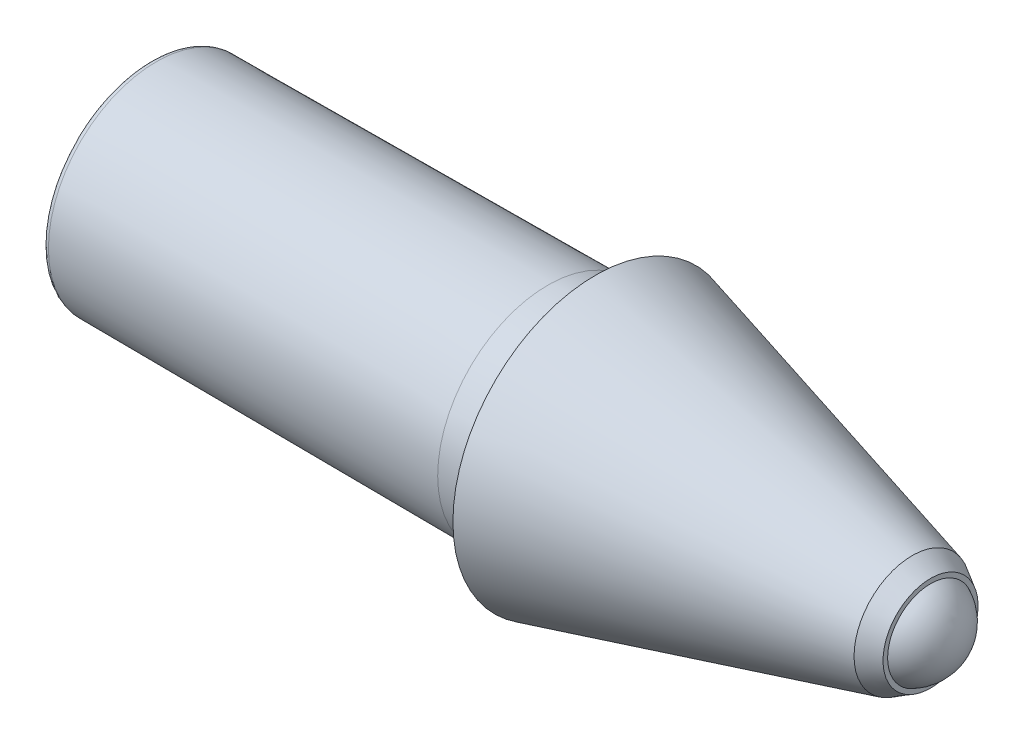
ISO-10303-21;
HEADER;
FILE_DESCRIPTION(('STEP AP214'),'2;1');
FILE_NAME('part.step','',(''),(''),'','','');
FILE_SCHEMA(('AUTOMOTIVE_DESIGN { 1 0 10303 214 1 1 1 1 }'));
ENDSEC;
DATA;
#1=APPLICATION_CONTEXT('core data for automotive mechanical design processes');
#2=APPLICATION_PROTOCOL_DEFINITION('international standard','automotive_design',2000,#1);
#3=PRODUCT_CONTEXT('',#1,'mechanical');
#4=PRODUCT('Part','Part','',(#3));
#5=PRODUCT_RELATED_PRODUCT_CATEGORY('part','',(#4));
#6=PRODUCT_DEFINITION_FORMATION('','',#4);
#7=PRODUCT_DEFINITION_CONTEXT('part definition',#1,'design');
#8=PRODUCT_DEFINITION('design','',#6,#7);
#9=PRODUCT_DEFINITION_SHAPE('','',#8);
#10=(LENGTH_UNIT() NAMED_UNIT(*) SI_UNIT(.MILLI.,.METRE.));
#11=(NAMED_UNIT(*) PLANE_ANGLE_UNIT() SI_UNIT($,.RADIAN.));
#12=(NAMED_UNIT(*) SI_UNIT($,.STERADIAN.) SOLID_ANGLE_UNIT());
#13=UNCERTAINTY_MEASURE_WITH_UNIT(LENGTH_MEASURE(1.E-05),#10,'distance_accuracy_value','');
#14=(GEOMETRIC_REPRESENTATION_CONTEXT(3) GLOBAL_UNCERTAINTY_ASSIGNED_CONTEXT((#13)) GLOBAL_UNIT_ASSIGNED_CONTEXT((#10,
#11,#12)) REPRESENTATION_CONTEXT('',''));
#15=CARTESIAN_POINT('',(0.,0.,0.));
#16=DIRECTION('',(0.,0.,1.));
#17=DIRECTION('',(1.,0.,0.));
#18=AXIS2_PLACEMENT_3D('',#15,#16,#17);
#19=CARTESIAN_POINT('',(6.40717755139267,0.,0.));
#20=DIRECTION('',(-1.,0.,0.));
#21=DIRECTION('',(0.,1.,0.));
#22=AXIS2_PLACEMENT_3D('',#19,#20,#21);
#23=SPHERICAL_SURFACE('',#22,0.4);
#24=CARTESIAN_POINT('',(6.00717755139267,0.,0.));
#25=VERTEX_POINT('',#24);
#26=VERTEX_LOOP('',#25);
#27=FACE_BOUND('',#26,.T.);
#28=ADVANCED_FACE('F46',(#27),#23,.T.);
#29=CLOSED_SHELL('',(#28));
#30=MANIFOLD_SOLID_BREP('B2',#29);
#31=CARTESIAN_POINT('',(6.42237748420659,0.,0.));
#32=DIRECTION('',(-1.,0.,0.));
#33=DIRECTION('',(0.,0.,1.));
#34=AXIS2_PLACEMENT_3D('',#31,#32,#33);
#35=CONICAL_SURFACE('',#34,0.490183784815235,0.259617726234157);
#36=CARTESIAN_POINT('',(3.75,0.,0.));
#37=DIRECTION('',(-1.,0.,0.));
#38=DIRECTION('',(0.,0.,1.));
#39=AXIS2_PLACEMENT_3D('',#36,#37,#38);
#40=CIRCLE('',#39,1.2);
#41=CARTESIAN_POINT('',(3.75,0.,1.2));
#42=VERTEX_POINT('',#41);
#43=EDGE_CURVE('E45',#42,#42,#40,.T.);
#44=ORIENTED_EDGE('',*,*,#43,.F.);
#45=EDGE_LOOP('',(#44));
#46=FACE_BOUND('',#45,.T.);
#47=CARTESIAN_POINT('',(6.42237748420659,0.,0.));
#48=DIRECTION('',(-1.,0.,0.));
#49=DIRECTION('',(0.,0.,1.));
#50=AXIS2_PLACEMENT_3D('',#47,#48,#49);
#51=CIRCLE('',#50,0.490183784815235);
#52=CARTESIAN_POINT('',(6.42237748420659,0.,0.490183784815235));
#53=VERTEX_POINT('',#52);
#54=EDGE_CURVE('E150',#53,#53,#51,.T.);
#55=ORIENTED_EDGE('',*,*,#54,.T.);
#56=EDGE_LOOP('',(#55));
#57=FACE_BOUND('',#56,.T.);
#58=ADVANCED_FACE('F71',(#46,#57),#35,.T.);
#59=CARTESIAN_POINT('',(3.75,1.15,0.));
#60=DIRECTION('',(1.,0.,0.));
#61=DIRECTION('',(0.,0.,-1.));
#62=AXIS2_PLACEMENT_3D('',#59,#60,#61);
#63=PLANE('',#62);
#64=CARTESIAN_POINT('',(3.75,0.,0.));
#65=DIRECTION('',(-1.,0.,0.));
#66=DIRECTION('',(0.,0.,1.));
#67=AXIS2_PLACEMENT_3D('',#64,#65,#66);
#68=CIRCLE('',#67,0.93);
#69=CARTESIAN_POINT('',(3.75,0.,0.93));
#70=VERTEX_POINT('',#69);
#71=EDGE_CURVE('E78',#70,#70,#68,.T.);
#72=ORIENTED_EDGE('',*,*,#71,.F.);
#73=EDGE_LOOP('',(#72));
#74=FACE_BOUND('',#73,.T.);
#75=ORIENTED_EDGE('',*,*,#43,.T.);
#76=EDGE_LOOP('',(#75));
#77=FACE_BOUND('',#76,.T.);
#78=ADVANCED_FACE('F250',(#74,#77),#63,.F.);
#79=CARTESIAN_POINT('',(3.75,0.,0.));
#80=DIRECTION('',(1.,0.,0.));
#81=DIRECTION('',(0.,0.,-1.));
#82=AXIS2_PLACEMENT_3D('',#79,#80,#81);
#83=CONICAL_SURFACE('',#82,0.93,0.00371192543636553);
#84=CARTESIAN_POINT('',(3.35,0.,0.));
#85=DIRECTION('',(-1.,0.,0.));
#86=DIRECTION('',(0.,0.,1.));
#87=AXIS2_PLACEMENT_3D('',#84,#85,#86);
#88=CIRCLE('',#87,0.928515223006169);
#89=CARTESIAN_POINT('',(3.35,0.,0.928515223006169));
#90=VERTEX_POINT('',#89);
#91=EDGE_CURVE('E86',#90,#90,#88,.T.);
#92=ORIENTED_EDGE('',*,*,#91,.F.);
#93=EDGE_LOOP('',(#92));
#94=FACE_BOUND('',#93,.T.);
#95=ORIENTED_EDGE('',*,*,#71,.T.);
#96=EDGE_LOOP('',(#95));
#97=FACE_BOUND('',#96,.T.);
#98=ADVANCED_FACE('F245',(#94,#97),#83,.T.);
#99=CARTESIAN_POINT('',(3.35,0.,0.));
#100=DIRECTION('',(1.,0.,0.));
#101=DIRECTION('',(0.,0.,-1.));
#102=AXIS2_PLACEMENT_3D('',#99,#100,#101);
#103=CONICAL_SURFACE('',#102,0.928515223006169,0.00552687596464925);
#104=CARTESIAN_POINT('',(0.0497236576086483,0.,0.));
#105=DIRECTION('',(-1.,0.,0.));
#106=DIRECTION('',(0.,0.,1.));
#107=AXIS2_PLACEMENT_3D('',#104,#105,#106);
#108=CIRCLE('',#107,0.91027481928636);
#109=CARTESIAN_POINT('',(0.0497236576086483,0.,0.91027481928636));
#110=VERTEX_POINT('',#109);
#111=EDGE_CURVE('E92',#110,#110,#108,.T.);
#112=ORIENTED_EDGE('',*,*,#111,.F.);
#113=EDGE_LOOP('',(#112));
#114=FACE_BOUND('',#113,.T.);
#115=ORIENTED_EDGE('',*,*,#91,.T.);
#116=EDGE_LOOP('',(#115));
#117=FACE_BOUND('',#116,.T.);
#118=ADVANCED_FACE('F239',(#114,#117),#103,.T.);
#119=CARTESIAN_POINT('',(0.05,0.,0.));
#120=DIRECTION('',(-1.,0.,0.));
#121=DIRECTION('',(0.,0.,1.));
#122=AXIS2_PLACEMENT_3D('',#119,#120,#121);
#123=TOROIDAL_SURFACE('',#122,0.860275582943364,0.05);
#124=CARTESIAN_POINT('',(0.,0.,0.));
#125=DIRECTION('',(-1.,0.,0.));
#126=DIRECTION('',(0.,0.,1.));
#127=AXIS2_PLACEMENT_3D('',#124,#125,#126);
#128=CIRCLE('',#127,0.860275582943364);
#129=CARTESIAN_POINT('',(0.,0.,0.860275582943364));
#130=VERTEX_POINT('',#129);
#131=EDGE_CURVE('E98',#130,#130,#128,.T.);
#132=ORIENTED_EDGE('',*,*,#131,.F.);
#133=EDGE_LOOP('',(#132));
#134=FACE_BOUND('',#133,.T.);
#135=ORIENTED_EDGE('',*,*,#111,.T.);
#136=EDGE_LOOP('',(#135));
#137=FACE_BOUND('',#136,.T.);
#138=ADVANCED_FACE('F233',(#134,#137),#123,.T.);
#139=CARTESIAN_POINT('',(0.,0.465,0.));
#140=DIRECTION('',(1.,0.,0.));
#141=DIRECTION('',(0.,0.,-1.));
#142=AXIS2_PLACEMENT_3D('',#139,#140,#141);
#143=PLANE('',#142);
#144=CARTESIAN_POINT('',(0.,0.,0.));
#145=DIRECTION('',(-1.,0.,0.));
#146=DIRECTION('',(0.,0.,1.));
#147=AXIS2_PLACEMENT_3D('',#144,#145,#146);
#148=CIRCLE('',#147,0.465);
#149=CARTESIAN_POINT('',(0.,0.,0.465));
#150=VERTEX_POINT('',#149);
#151=EDGE_CURVE('E102',#150,#150,#148,.T.);
#152=ORIENTED_EDGE('',*,*,#151,.F.);
#153=EDGE_LOOP('',(#152));
#154=FACE_BOUND('',#153,.T.);
#155=ORIENTED_EDGE('',*,*,#131,.T.);
#156=EDGE_LOOP('',(#155));
#157=FACE_BOUND('',#156,.T.);
#158=ADVANCED_FACE('F227',(#154,#157),#143,.F.);
#159=CARTESIAN_POINT('',(-2.,0.,0.));
#160=DIRECTION('',(-1.,0.,0.));
#161=DIRECTION('',(0.,0.,1.));
#162=AXIS2_PLACEMENT_3D('',#159,#160,#161);
#163=CYLINDRICAL_SURFACE('',#162,0.465);
#164=CARTESIAN_POINT('',(0.6,0.,0.));
#165=DIRECTION('',(-1.,0.,0.));
#166=DIRECTION('',(0.,0.,1.));
#167=AXIS2_PLACEMENT_3D('',#164,#165,#166);
#168=CIRCLE('',#167,0.465);
#169=CARTESIAN_POINT('',(0.6,0.,0.465));
#170=VERTEX_POINT('',#169);
#171=EDGE_CURVE('E106',#170,#170,#168,.T.);
#172=ORIENTED_EDGE('',*,*,#171,.F.);
#173=EDGE_LOOP('',(#172));
#174=FACE_BOUND('',#173,.T.);
#175=ORIENTED_EDGE('',*,*,#151,.T.);
#176=EDGE_LOOP('',(#175));
#177=FACE_BOUND('',#176,.T.);
#178=ADVANCED_FACE('F221',(#174,#177),#163,.F.);
#179=CARTESIAN_POINT('',(0.6,0.,0.));
#180=DIRECTION('',(-1.,0.,0.));
#181=DIRECTION('',(0.,0.,1.));
#182=AXIS2_PLACEMENT_3D('',#179,#180,#181);
#183=CONICAL_SURFACE('',#182,0.465,0.392699081698724);
#184=CARTESIAN_POINT('',(0.636213203435597,0.,0.));
#185=DIRECTION('',(-1.,0.,0.));
#186=DIRECTION('',(0.,0.,1.));
#187=AXIS2_PLACEMENT_3D('',#184,#185,#186);
#188=CIRCLE('',#187,0.45);
#189=CARTESIAN_POINT('',(0.636213203435597,0.,0.45));
#190=VERTEX_POINT('',#189);
#191=EDGE_CURVE('E110',#190,#190,#188,.T.);
#192=ORIENTED_EDGE('',*,*,#191,.F.);
#193=EDGE_LOOP('',(#192));
#194=FACE_BOUND('',#193,.T.);
#195=ORIENTED_EDGE('',*,*,#171,.T.);
#196=EDGE_LOOP('',(#195));
#197=FACE_BOUND('',#196,.T.);
#198=ADVANCED_FACE('F215',(#194,#197),#183,.F.);
#199=CARTESIAN_POINT('',(-2.,0.,0.));
#200=DIRECTION('',(-1.,0.,0.));
#201=DIRECTION('',(0.,0.,1.));
#202=AXIS2_PLACEMENT_3D('',#199,#200,#201);
#203=CYLINDRICAL_SURFACE('',#202,0.45);
#204=CARTESIAN_POINT('',(3.,0.,0.));
#205=DIRECTION('',(-1.,0.,0.));
#206=DIRECTION('',(0.,0.,1.));
#207=AXIS2_PLACEMENT_3D('',#204,#205,#206);
#208=CIRCLE('',#207,0.45);
#209=CARTESIAN_POINT('',(3.,0.,0.45));
#210=VERTEX_POINT('',#209);
#211=EDGE_CURVE('E114',#210,#210,#208,.T.);
#212=ORIENTED_EDGE('',*,*,#211,.F.);
#213=EDGE_LOOP('',(#212));
#214=FACE_BOUND('',#213,.T.);
#215=ORIENTED_EDGE('',*,*,#191,.T.);
#216=EDGE_LOOP('',(#215));
#217=FACE_BOUND('',#216,.T.);
#218=ADVANCED_FACE('F209',(#214,#217),#203,.F.);
#219=CARTESIAN_POINT('',(3.,0.,0.));
#220=DIRECTION('',(-1.,0.,0.));
#221=DIRECTION('',(0.,0.,1.));
#222=AXIS2_PLACEMENT_3D('',#219,#220,#221);
#223=CONICAL_SURFACE('',#222,0.45,1.0471975511966);
#224=CARTESIAN_POINT('',(3.02886751345948,0.,0.));
#225=DIRECTION('',(-1.,0.,0.));
#226=DIRECTION('',(0.,0.,1.));
#227=AXIS2_PLACEMENT_3D('',#224,#225,#226);
#228=CIRCLE('',#227,0.4);
#229=CARTESIAN_POINT('',(3.02886751345948,0.,0.4));
#230=VERTEX_POINT('',#229);
#231=EDGE_CURVE('E118',#230,#230,#228,.T.);
#232=ORIENTED_EDGE('',*,*,#231,.F.);
#233=EDGE_LOOP('',(#232));
#234=FACE_BOUND('',#233,.T.);
#235=ORIENTED_EDGE('',*,*,#211,.T.);
#236=EDGE_LOOP('',(#235));
#237=FACE_BOUND('',#236,.T.);
#238=ADVANCED_FACE('F203',(#234,#237),#223,.F.);
#239=CARTESIAN_POINT('',(-2.,0.,0.));
#240=DIRECTION('',(-1.,0.,0.));
#241=DIRECTION('',(0.,0.,1.));
#242=AXIS2_PLACEMENT_3D('',#239,#240,#241);
#243=CYLINDRICAL_SURFACE('',#242,0.4);
#244=CARTESIAN_POINT('',(5.5,0.,0.));
#245=DIRECTION('',(-1.,0.,0.));
#246=DIRECTION('',(0.,0.,1.));
#247=AXIS2_PLACEMENT_3D('',#244,#245,#246);
#248=CIRCLE('',#247,0.4);
#249=CARTESIAN_POINT('',(5.5,0.,0.4));
#250=VERTEX_POINT('',#249);
#251=EDGE_CURVE('E122',#250,#250,#248,.T.);
#252=ORIENTED_EDGE('',*,*,#251,.F.);
#253=EDGE_LOOP('',(#252));
#254=FACE_BOUND('',#253,.T.);
#255=ORIENTED_EDGE('',*,*,#231,.T.);
#256=EDGE_LOOP('',(#255));
#257=FACE_BOUND('',#256,.T.);
#258=ADVANCED_FACE('F197',(#254,#257),#243,.F.);
#259=CARTESIAN_POINT('',(5.5,0.,0.));
#260=DIRECTION('',(-1.,0.,0.));
#261=DIRECTION('',(0.,0.,1.));
#262=AXIS2_PLACEMENT_3D('',#259,#260,#261);
#263=CONICAL_SURFACE('',#262,0.4,1.04719755119661);
#264=CARTESIAN_POINT('',(5.58660254037843,0.,0.));
#265=DIRECTION('',(-1.,0.,0.));
#266=DIRECTION('',(0.,0.,1.));
#267=AXIS2_PLACEMENT_3D('',#264,#265,#266);
#268=CIRCLE('',#267,0.250000000000019);
#269=CARTESIAN_POINT('',(5.58660254037843,0.,0.250000000000019));
#270=VERTEX_POINT('',#269);
#271=EDGE_CURVE('E126',#270,#270,#268,.T.);
#272=ORIENTED_EDGE('',*,*,#271,.F.);
#273=EDGE_LOOP('',(#272));
#274=FACE_BOUND('',#273,.T.);
#275=ORIENTED_EDGE('',*,*,#251,.T.);
#276=EDGE_LOOP('',(#275));
#277=FACE_BOUND('',#276,.T.);
#278=ADVANCED_FACE('F191',(#274,#277),#263,.F.);
#279=CARTESIAN_POINT('',(-2.,0.,0.));
#280=DIRECTION('',(-1.,0.,0.));
#281=DIRECTION('',(0.,0.,1.));
#282=AXIS2_PLACEMENT_3D('',#279,#280,#281);
#283=CYLINDRICAL_SURFACE('',#282,0.250000000000019);
#284=CARTESIAN_POINT('',(6.09149212644345,0.,0.));
#285=DIRECTION('',(-1.,0.,0.));
#286=DIRECTION('',(0.,0.,1.));
#287=AXIS2_PLACEMENT_3D('',#284,#285,#286);
#288=CIRCLE('',#287,0.250000000000019);
#289=CARTESIAN_POINT('',(6.09149212644345,0.,0.250000000000019));
#290=VERTEX_POINT('',#289);
#291=EDGE_CURVE('E130',#290,#290,#288,.T.);
#292=ORIENTED_EDGE('',*,*,#291,.F.);
#293=EDGE_LOOP('',(#292));
#294=FACE_BOUND('',#293,.T.);
#295=ORIENTED_EDGE('',*,*,#271,.T.);
#296=EDGE_LOOP('',(#295));
#297=FACE_BOUND('',#296,.T.);
#298=ADVANCED_FACE('F185',(#294,#297),#283,.F.);
#299=CARTESIAN_POINT('',(6.09149212644345,0.,0.));
#300=DIRECTION('',(1.,0.,0.));
#301=DIRECTION('',(0.,0.,-1.));
#302=AXIS2_PLACEMENT_3D('',#299,#300,#301);
#303=CONICAL_SURFACE('',#302,0.250000000000019,0.785398163397442);
#304=CARTESIAN_POINT('',(6.24149212644344,0.,0.));
#305=DIRECTION('',(-1.,0.,0.));
#306=DIRECTION('',(0.,0.,1.));
#307=AXIS2_PLACEMENT_3D('',#304,#305,#306);
#308=CIRCLE('',#307,0.400000000000001);
#309=CARTESIAN_POINT('',(6.24149212644344,0.,0.400000000000001));
#310=VERTEX_POINT('',#309);
#311=EDGE_CURVE('E134',#310,#310,#308,.T.);
#312=ORIENTED_EDGE('',*,*,#311,.F.);
#313=EDGE_LOOP('',(#312));
#314=FACE_BOUND('',#313,.T.);
#315=ORIENTED_EDGE('',*,*,#291,.T.);
#316=EDGE_LOOP('',(#315));
#317=FACE_BOUND('',#316,.T.);
#318=ADVANCED_FACE('F179',(#314,#317),#303,.F.);
#319=CARTESIAN_POINT('',(-2.,0.,0.));
#320=DIRECTION('',(-1.,0.,0.));
#321=DIRECTION('',(0.,0.,1.));
#322=AXIS2_PLACEMENT_3D('',#319,#320,#321);
#323=CYLINDRICAL_SURFACE('',#322,0.400000000000001);
#324=CARTESIAN_POINT('',(6.40717755139267,0.,0.));
#325=DIRECTION('',(-1.,0.,0.));
#326=DIRECTION('',(0.,0.,1.));
#327=AXIS2_PLACEMENT_3D('',#324,#325,#326);
#328=CIRCLE('',#327,0.4);
#329=CARTESIAN_POINT('',(6.40717755139267,0.,0.4));
#330=VERTEX_POINT('',#329);
#331=EDGE_CURVE('E138',#330,#330,#328,.T.);
#332=ORIENTED_EDGE('',*,*,#331,.F.);
#333=EDGE_LOOP('',(#332));
#334=FACE_BOUND('',#333,.T.);
#335=ORIENTED_EDGE('',*,*,#311,.T.);
#336=EDGE_LOOP('',(#335));
#337=FACE_BOUND('',#336,.T.);
#338=ADVANCED_FACE('F173',(#334,#337),#323,.F.);
#339=CARTESIAN_POINT('',(6.40717755139267,0.,0.));
#340=DIRECTION('',(-1.,0.,0.));
#341=DIRECTION('',(0.,1.,0.));
#342=AXIS2_PLACEMENT_3D('',#339,#340,#341);
#343=SPHERICAL_SURFACE('',#342,0.4);
#344=CARTESIAN_POINT('',(6.57717755139267,0.,0.));
#345=DIRECTION('',(-1.,0.,0.));
#346=DIRECTION('',(0.,0.,1.));
#347=AXIS2_PLACEMENT_3D('',#344,#345,#346);
#348=CIRCLE('',#347,0.362077339804633);
#349=CARTESIAN_POINT('',(6.57717755139267,0.,0.362077339804633));
#350=VERTEX_POINT('',#349);
#351=EDGE_CURVE('E142',#350,#350,#348,.T.);
#352=ORIENTED_EDGE('',*,*,#351,.F.);
#353=EDGE_LOOP('',(#352));
#354=FACE_BOUND('',#353,.T.);
#355=ORIENTED_EDGE('',*,*,#331,.T.);
#356=EDGE_LOOP('',(#355));
#357=FACE_BOUND('',#356,.T.);
#358=ADVANCED_FACE('F167',(#354,#357),#343,.F.);
#359=CARTESIAN_POINT('',(6.57717755139267,0.362077339804634,0.));
#360=DIRECTION('',(-1.,0.,0.));
#361=DIRECTION('',(0.,0.,1.));
#362=AXIS2_PLACEMENT_3D('',#359,#360,#361);
#363=PLANE('',#362);
#364=CARTESIAN_POINT('',(6.57717755139267,0.,0.));
#365=DIRECTION('',(-1.,0.,0.));
#366=DIRECTION('',(0.,0.,1.));
#367=AXIS2_PLACEMENT_3D('',#364,#365,#366);
#368=CIRCLE('',#367,0.400809924354783);
#369=CARTESIAN_POINT('',(6.57717755139267,0.,0.400809924354783));
#370=VERTEX_POINT('',#369);
#371=EDGE_CURVE('E146',#370,#370,#368,.T.);
#372=ORIENTED_EDGE('',*,*,#371,.F.);
#373=EDGE_LOOP('',(#372));
#374=FACE_BOUND('',#373,.T.);
#375=ORIENTED_EDGE('',*,*,#351,.T.);
#376=EDGE_LOOP('',(#375));
#377=FACE_BOUND('',#376,.T.);
#378=ADVANCED_FACE('F161',(#374,#377),#363,.F.);
#379=CARTESIAN_POINT('',(6.57717755139267,0.,0.));
#380=DIRECTION('',(-1.,0.,0.));
#381=DIRECTION('',(0.,0.,1.));
#382=AXIS2_PLACEMENT_3D('',#379,#380,#381);
#383=CONICAL_SURFACE('',#382,0.400809924354783,0.523598775598292);
#384=ORIENTED_EDGE('',*,*,#54,.F.);
#385=EDGE_LOOP('',(#384));
#386=FACE_BOUND('',#385,.T.);
#387=ORIENTED_EDGE('',*,*,#371,.T.);
#388=EDGE_LOOP('',(#387));
#389=FACE_BOUND('',#388,.T.);
#390=ADVANCED_FACE('F158',(#386,#389),#383,.T.);
#391=CLOSED_SHELL('',(#58,#78,#98,#118,#138,#158,#178,#198,#218,#238,#258,#278,#298,#318,#338,
#358,#378,#390));
#392=MANIFOLD_SOLID_BREP('B7',#391);
#393=ADVANCED_BREP_SHAPE_REPRESENTATION('',(#18,#30,#392),#14);
#394=SHAPE_DEFINITION_REPRESENTATION(#9,#393);
ENDSEC;
END-ISO-10303-21;
